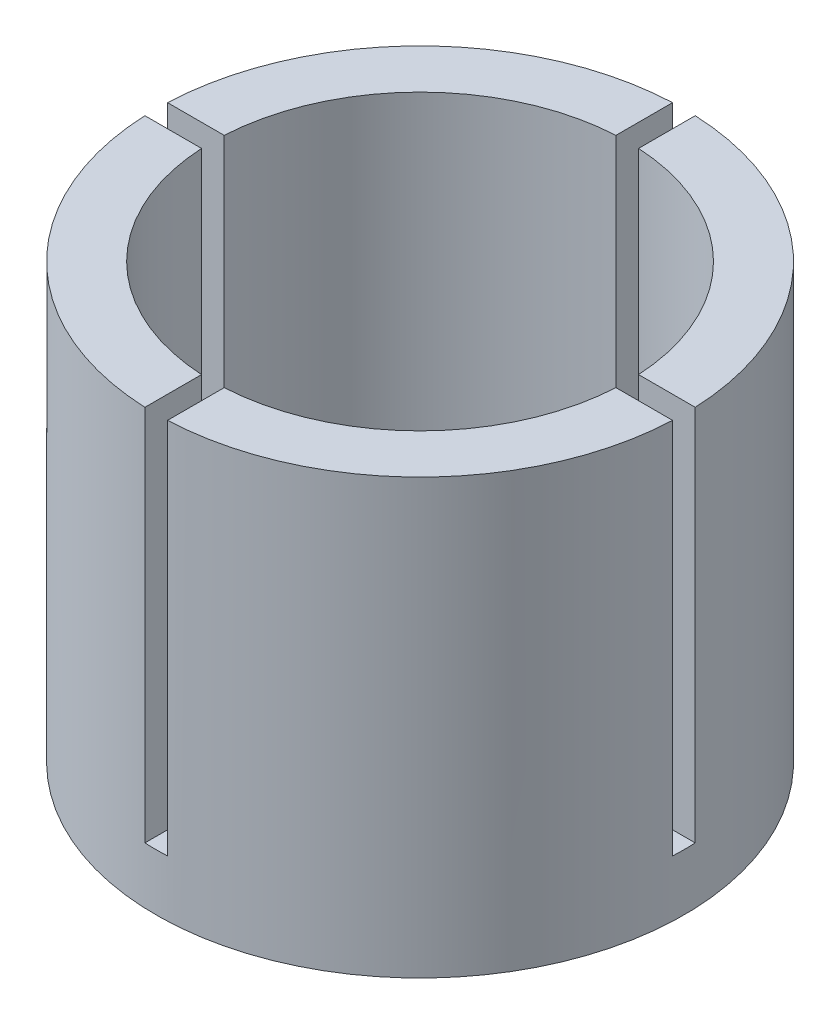
ISO-10303-21;
HEADER;
FILE_DESCRIPTION(('STEP AP214'),'2;1');
FILE_NAME('part.step','',(''),(''),'','','');
FILE_SCHEMA(('AUTOMOTIVE_DESIGN { 1 0 10303 214 1 1 1 1 }'));
ENDSEC;
DATA;
#1=APPLICATION_CONTEXT('core data for automotive mechanical design processes');
#2=APPLICATION_PROTOCOL_DEFINITION('international standard','automotive_design',2000,#1);
#3=PRODUCT_CONTEXT('',#1,'mechanical');
#4=PRODUCT('Part','Part','',(#3));
#5=PRODUCT_RELATED_PRODUCT_CATEGORY('part','',(#4));
#6=PRODUCT_DEFINITION_FORMATION('','',#4);
#7=PRODUCT_DEFINITION_CONTEXT('part definition',#1,'design');
#8=PRODUCT_DEFINITION('design','',#6,#7);
#9=PRODUCT_DEFINITION_SHAPE('','',#8);
#10=(LENGTH_UNIT() NAMED_UNIT(*) SI_UNIT(.MILLI.,.METRE.));
#11=(NAMED_UNIT(*) PLANE_ANGLE_UNIT() SI_UNIT($,.RADIAN.));
#12=(NAMED_UNIT(*) SI_UNIT($,.STERADIAN.) SOLID_ANGLE_UNIT());
#13=UNCERTAINTY_MEASURE_WITH_UNIT(LENGTH_MEASURE(1.E-05),#10,'distance_accuracy_value','');
#14=(GEOMETRIC_REPRESENTATION_CONTEXT(3) GLOBAL_UNCERTAINTY_ASSIGNED_CONTEXT((#13)) GLOBAL_UNIT_ASSIGNED_CONTEXT((#10,
#11,#12)) REPRESENTATION_CONTEXT('',''));
#15=CARTESIAN_POINT('',(0.,0.,0.));
#16=DIRECTION('',(0.,0.,1.));
#17=DIRECTION('',(1.,0.,0.));
#18=AXIS2_PLACEMENT_3D('',#15,#16,#17);
#19=CARTESIAN_POINT('',(14.,23.,0.));
#20=DIRECTION('',(0.,-1.,0.));
#21=DIRECTION('',(1.,0.,0.));
#22=AXIS2_PLACEMENT_3D('',#19,#20,#21);
#23=PLANE('',#22);
#24=DIRECTION('',(0.,0.,-1.));
#25=VECTOR('',#24,1.);
#26=CARTESIAN_POINT('',(-0.600000000000002,23.,0.));
#27=LINE('',#26,#25);
#28=CARTESIAN_POINT('',(-0.600000000000002,23.,13.9871369479247));
#29=VERTEX_POINT('',#28);
#30=CARTESIAN_POINT('',(-0.600000000000002,23.,10.9836241741968));
#31=VERTEX_POINT('',#30);
#32=EDGE_CURVE('E146',#29,#31,#27,.T.);
#33=ORIENTED_EDGE('',*,*,#32,.T.);
#34=CARTESIAN_POINT('',(0.,23.,0.));
#35=DIRECTION('',(0.,1.,0.));
#36=DIRECTION('',(-1.,0.,0.));
#37=AXIS2_PLACEMENT_3D('',#34,#35,#36);
#38=CIRCLE('',#37,11.);
#39=CARTESIAN_POINT('',(-10.9836241741968,23.,0.6));
#40=VERTEX_POINT('',#39);
#41=EDGE_CURVE('E177',#40,#31,#38,.T.);
#42=ORIENTED_EDGE('',*,*,#41,.F.);
#43=DIRECTION('',(1.,0.,0.));
#44=VECTOR('',#43,1.);
#45=CARTESIAN_POINT('',(0.,23.,0.6));
#46=LINE('',#45,#44);
#47=CARTESIAN_POINT('',(-13.9871369479247,23.,0.6));
#48=VERTEX_POINT('',#47);
#49=EDGE_CURVE('E170',#48,#40,#46,.T.);
#50=ORIENTED_EDGE('',*,*,#49,.F.);
#51=CARTESIAN_POINT('',(0.,23.,0.));
#52=DIRECTION('',(0.,1.,0.));
#53=DIRECTION('',(-1.,0.,0.));
#54=AXIS2_PLACEMENT_3D('',#51,#52,#53);
#55=CIRCLE('',#54,14.);
#56=EDGE_CURVE('E41',#48,#29,#55,.T.);
#57=ORIENTED_EDGE('',*,*,#56,.T.);
#58=EDGE_LOOP('',(#33,#42,#50,#57));
#59=FACE_BOUND('',#58,.T.);
#60=ADVANCED_FACE('F33',(#59),#23,.F.);
#61=DIRECTION('',(1.,0.,0.));
#62=VECTOR('',#61,1.);
#63=CARTESIAN_POINT('',(0.,23.,-0.6));
#64=LINE('',#63,#62);
#65=CARTESIAN_POINT('',(10.9836241741968,23.,-0.6));
#66=VERTEX_POINT('',#65);
#67=CARTESIAN_POINT('',(13.9871369479247,23.,-0.6));
#68=VERTEX_POINT('',#67);
#69=EDGE_CURVE('E255',#66,#68,#64,.T.);
#70=ORIENTED_EDGE('',*,*,#69,.T.);
#71=CARTESIAN_POINT('',(0.599999999999998,23.,-13.9871369479247));
#72=VERTEX_POINT('',#71);
#73=EDGE_CURVE('E174',#68,#72,#55,.T.);
#74=ORIENTED_EDGE('',*,*,#73,.T.);
#75=DIRECTION('',(0.,0.,-1.));
#76=VECTOR('',#75,1.);
#77=CARTESIAN_POINT('',(0.599999999999998,23.,0.));
#78=LINE('',#77,#76);
#79=CARTESIAN_POINT('',(0.599999999999998,23.,-10.9836241741968));
#80=VERTEX_POINT('',#79);
#81=EDGE_CURVE('E249',#80,#72,#78,.T.);
#82=ORIENTED_EDGE('',*,*,#81,.F.);
#83=EDGE_CURVE('E188',#66,#80,#38,.T.);
#84=ORIENTED_EDGE('',*,*,#83,.F.);
#85=EDGE_LOOP('',(#70,#74,#82,#84));
#86=FACE_BOUND('',#85,.T.);
#87=ADVANCED_FACE('F325',(#86),#23,.F.);
#88=DIRECTION('',(0.,0.,-1.));
#89=VECTOR('',#88,1.);
#90=CARTESIAN_POINT('',(-0.600000000000002,23.,0.));
#91=LINE('',#90,#89);
#92=CARTESIAN_POINT('',(-0.600000000000002,23.,-10.9836241741968));
#93=VERTEX_POINT('',#92);
#94=CARTESIAN_POINT('',(-0.600000000000002,23.,-13.9871369479247));
#95=VERTEX_POINT('',#94);
#96=EDGE_CURVE('E237',#93,#95,#91,.T.);
#97=ORIENTED_EDGE('',*,*,#96,.T.);
#98=CARTESIAN_POINT('',(-13.9871369479247,23.,-0.6));
#99=VERTEX_POINT('',#98);
#100=EDGE_CURVE('E172',#95,#99,#55,.T.);
#101=ORIENTED_EDGE('',*,*,#100,.T.);
#102=DIRECTION('',(1.,0.,0.));
#103=VECTOR('',#102,1.);
#104=CARTESIAN_POINT('',(0.,23.,-0.6));
#105=LINE('',#104,#103);
#106=CARTESIAN_POINT('',(-10.9836241741968,23.,-0.6));
#107=VERTEX_POINT('',#106);
#108=EDGE_CURVE('E218',#99,#107,#105,.T.);
#109=ORIENTED_EDGE('',*,*,#108,.T.);
#110=EDGE_CURVE('E184',#93,#107,#38,.T.);
#111=ORIENTED_EDGE('',*,*,#110,.F.);
#112=EDGE_LOOP('',(#97,#101,#109,#111));
#113=FACE_BOUND('',#112,.T.);
#114=ADVANCED_FACE('F312',(#113),#23,.F.);
#115=CARTESIAN_POINT('',(0.,8.,0.));
#116=DIRECTION('',(0.,1.,0.));
#117=DIRECTION('',(-1.,0.,0.));
#118=AXIS2_PLACEMENT_3D('',#115,#116,#117);
#119=CYLINDRICAL_SURFACE('',#118,11.);
#120=DIRECTION('',(0.,1.,0.));
#121=VECTOR('',#120,1.);
#122=CARTESIAN_POINT('',(-0.600000000000003,-0.246309153868442,10.9836241741968));
#123=LINE('',#122,#121);
#124=CARTESIAN_POINT('',(-0.600000000000002,3.,10.9836241741968));
#125=VERTEX_POINT('',#124);
#126=EDGE_CURVE('E152',#125,#31,#123,.T.);
#127=ORIENTED_EDGE('',*,*,#126,.F.);
#128=CARTESIAN_POINT('',(0.,3.,0.));
#129=DIRECTION('',(0.,1.,0.));
#130=DIRECTION('',(-1.,0.,0.));
#131=AXIS2_PLACEMENT_3D('',#128,#129,#130);
#132=CIRCLE('',#131,11.);
#133=CARTESIAN_POINT('',(-10.9836241741968,3.,0.6));
#134=VERTEX_POINT('',#133);
#135=EDGE_CURVE('E191',#134,#125,#132,.T.);
#136=ORIENTED_EDGE('',*,*,#135,.F.);
#137=DIRECTION('',(0.,1.,0.));
#138=VECTOR('',#137,1.);
#139=CARTESIAN_POINT('',(-10.9836241741968,-0.246309153868442,0.6));
#140=LINE('',#139,#138);
#141=EDGE_CURVE('E224',#134,#40,#140,.T.);
#142=ORIENTED_EDGE('',*,*,#141,.T.);
#143=ORIENTED_EDGE('',*,*,#41,.T.);
#144=EDGE_LOOP('',(#127,#136,#142,#143));
#145=FACE_BOUND('',#144,.T.);
#146=ADVANCED_FACE('F304',(#145),#119,.F.);
#147=DIRECTION('',(0.,1.,0.));
#148=VECTOR('',#147,1.);
#149=CARTESIAN_POINT('',(10.9836241741968,-0.246309153868442,-0.6));
#150=LINE('',#149,#148);
#151=CARTESIAN_POINT('',(10.9836241741968,3.,-0.6));
#152=VERTEX_POINT('',#151);
#153=EDGE_CURVE('E56',#152,#66,#150,.T.);
#154=ORIENTED_EDGE('',*,*,#153,.T.);
#155=ORIENTED_EDGE('',*,*,#83,.T.);
#156=DIRECTION('',(0.,1.,0.));
#157=VECTOR('',#156,1.);
#158=CARTESIAN_POINT('',(0.599999999999997,-0.246309153868442,-10.9836241741968));
#159=LINE('',#158,#157);
#160=CARTESIAN_POINT('',(0.599999999999997,3.,-10.9836241741968));
#161=VERTEX_POINT('',#160);
#162=EDGE_CURVE('E234',#161,#80,#159,.T.);
#163=ORIENTED_EDGE('',*,*,#162,.F.);
#164=EDGE_CURVE('E202',#152,#161,#132,.T.);
#165=ORIENTED_EDGE('',*,*,#164,.F.);
#166=EDGE_LOOP('',(#154,#155,#163,#165));
#167=FACE_BOUND('',#166,.T.);
#168=ADVANCED_FACE('F322',(#167),#119,.F.);
#169=DIRECTION('',(0.,1.,0.));
#170=VECTOR('',#169,1.);
#171=CARTESIAN_POINT('',(-0.600000000000003,-0.246309153868442,-10.9836241741968));
#172=LINE('',#171,#170);
#173=CARTESIAN_POINT('',(-0.600000000000002,3.,-10.9836241741968));
#174=VERTEX_POINT('',#173);
#175=EDGE_CURVE('E245',#174,#93,#172,.T.);
#176=ORIENTED_EDGE('',*,*,#175,.T.);
#177=ORIENTED_EDGE('',*,*,#110,.T.);
#178=DIRECTION('',(0.,1.,0.));
#179=VECTOR('',#178,1.);
#180=CARTESIAN_POINT('',(-10.9836241741968,-0.246309153868442,-0.6));
#181=LINE('',#180,#179);
#182=CARTESIAN_POINT('',(-10.9836241741968,3.,-0.6));
#183=VERTEX_POINT('',#182);
#184=EDGE_CURVE('E219',#183,#107,#181,.T.);
#185=ORIENTED_EDGE('',*,*,#184,.F.);
#186=EDGE_CURVE('E199',#174,#183,#132,.T.);
#187=ORIENTED_EDGE('',*,*,#186,.F.);
#188=EDGE_LOOP('',(#176,#177,#185,#187));
#189=FACE_BOUND('',#188,.T.);
#190=ADVANCED_FACE('F346',(#189),#119,.F.);
#191=CARTESIAN_POINT('',(0.,0.,0.));
#192=DIRECTION('',(0.,1.,0.));
#193=DIRECTION('',(-1.,0.,0.));
#194=AXIS2_PLACEMENT_3D('',#191,#192,#193);
#195=PLANE('',#194);
#196=CARTESIAN_POINT('',(0.,0.,0.));
#197=DIRECTION('',(0.,1.,0.));
#198=DIRECTION('',(-1.,0.,0.));
#199=AXIS2_PLACEMENT_3D('',#196,#197,#198);
#200=CIRCLE('',#199,14.);
#201=CARTESIAN_POINT('',(-14.,0.,0.));
#202=VERTEX_POINT('',#201);
#203=EDGE_CURVE('E11',#202,#202,#200,.T.);
#204=ORIENTED_EDGE('',*,*,#203,.F.);
#205=EDGE_LOOP('',(#204));
#206=FACE_BOUND('',#205,.T.);
#207=ADVANCED_FACE('F35',(#206),#195,.F.);
#208=CARTESIAN_POINT('',(0.,8.,0.));
#209=DIRECTION('',(0.,1.,0.));
#210=DIRECTION('',(-1.,0.,0.));
#211=AXIS2_PLACEMENT_3D('',#208,#209,#210);
#212=CYLINDRICAL_SURFACE('',#211,14.);
#213=CARTESIAN_POINT('',(0.599999999999998,23.,13.9871369479247));
#214=VERTEX_POINT('',#213);
#215=CARTESIAN_POINT('',(13.9871369479247,23.,0.6));
#216=VERTEX_POINT('',#215);
#217=EDGE_CURVE('E171',#214,#216,#55,.T.);
#218=ORIENTED_EDGE('',*,*,#217,.F.);
#219=DIRECTION('',(0.,1.,0.));
#220=VECTOR('',#219,1.);
#221=CARTESIAN_POINT('',(0.599999999999997,-0.246309153868442,13.9871369479247));
#222=LINE('',#221,#220);
#223=CARTESIAN_POINT('',(0.599999999999997,3.,13.9871369479247));
#224=VERTEX_POINT('',#223);
#225=EDGE_CURVE('E212',#224,#214,#222,.T.);
#226=ORIENTED_EDGE('',*,*,#225,.F.);
#227=CARTESIAN_POINT('',(0.,3.,0.));
#228=DIRECTION('',(0.,-1.,0.));
#229=DIRECTION('',(1.,0.,0.));
#230=AXIS2_PLACEMENT_3D('',#227,#228,#229);
#231=CIRCLE('',#230,14.);
#232=CARTESIAN_POINT('',(-0.600000000000003,3.,13.9871369479247));
#233=VERTEX_POINT('',#232);
#234=EDGE_CURVE('E157',#233,#224,#231,.F.);
#235=ORIENTED_EDGE('',*,*,#234,.F.);
#236=DIRECTION('',(0.,1.,0.));
#237=VECTOR('',#236,1.);
#238=CARTESIAN_POINT('',(-0.600000000000003,-0.246309153868442,13.9871369479247));
#239=LINE('',#238,#237);
#240=EDGE_CURVE('E149',#233,#29,#239,.T.);
#241=ORIENTED_EDGE('',*,*,#240,.T.);
#242=ORIENTED_EDGE('',*,*,#56,.F.);
#243=DIRECTION('',(0.,1.,0.));
#244=VECTOR('',#243,1.);
#245=CARTESIAN_POINT('',(-13.9871369479247,-0.246309153868442,0.6));
#246=LINE('',#245,#244);
#247=CARTESIAN_POINT('',(-13.9871369479247,3.,0.6));
#248=VERTEX_POINT('',#247);
#249=EDGE_CURVE('E220',#248,#48,#246,.T.);
#250=ORIENTED_EDGE('',*,*,#249,.F.);
#251=CARTESIAN_POINT('',(0.,3.,0.));
#252=DIRECTION('',(0.,-1.,0.));
#253=DIRECTION('',(1.,0.,0.));
#254=AXIS2_PLACEMENT_3D('',#251,#252,#253);
#255=CIRCLE('',#254,14.);
#256=CARTESIAN_POINT('',(-13.9871369479247,3.,-0.6));
#257=VERTEX_POINT('',#256);
#258=EDGE_CURVE('E223',#257,#248,#255,.F.);
#259=ORIENTED_EDGE('',*,*,#258,.F.);
#260=DIRECTION('',(0.,1.,0.));
#261=VECTOR('',#260,1.);
#262=CARTESIAN_POINT('',(-13.9871369479247,-0.246309153868442,-0.6));
#263=LINE('',#262,#261);
#264=EDGE_CURVE('E215',#257,#99,#263,.T.);
#265=ORIENTED_EDGE('',*,*,#264,.T.);
#266=ORIENTED_EDGE('',*,*,#100,.F.);
#267=DIRECTION('',(0.,1.,0.));
#268=VECTOR('',#267,1.);
#269=CARTESIAN_POINT('',(-0.600000000000003,-0.246309153868442,-13.9871369479247));
#270=LINE('',#269,#268);
#271=CARTESIAN_POINT('',(-0.600000000000002,3.,-13.9871369479247));
#272=VERTEX_POINT('',#271);
#273=EDGE_CURVE('E243',#272,#95,#270,.T.);
#274=ORIENTED_EDGE('',*,*,#273,.F.);
#275=CARTESIAN_POINT('',(0.,3.,0.));
#276=DIRECTION('',(0.,-1.,0.));
#277=DIRECTION('',(1.,0.,0.));
#278=AXIS2_PLACEMENT_3D('',#275,#276,#277);
#279=CIRCLE('',#278,14.);
#280=CARTESIAN_POINT('',(0.599999999999997,3.,-13.9871369479247));
#281=VERTEX_POINT('',#280);
#282=EDGE_CURVE('E241',#281,#272,#279,.F.);
#283=ORIENTED_EDGE('',*,*,#282,.F.);
#284=DIRECTION('',(0.,1.,0.));
#285=VECTOR('',#284,1.);
#286=CARTESIAN_POINT('',(0.599999999999997,-0.246309153868442,-13.9871369479247));
#287=LINE('',#286,#285);
#288=EDGE_CURVE('E238',#281,#72,#287,.T.);
#289=ORIENTED_EDGE('',*,*,#288,.T.);
#290=ORIENTED_EDGE('',*,*,#73,.F.);
#291=DIRECTION('',(0.,1.,0.));
#292=VECTOR('',#291,1.);
#293=CARTESIAN_POINT('',(13.9871369479247,-0.246309153868442,-0.6));
#294=LINE('',#293,#292);
#295=CARTESIAN_POINT('',(13.9871369479247,3.,-0.6));
#296=VERTEX_POINT('',#295);
#297=EDGE_CURVE('E256',#296,#68,#294,.T.);
#298=ORIENTED_EDGE('',*,*,#297,.F.);
#299=CARTESIAN_POINT('',(0.,3.,0.));
#300=DIRECTION('',(0.,-1.,0.));
#301=DIRECTION('',(1.,0.,0.));
#302=AXIS2_PLACEMENT_3D('',#299,#300,#301);
#303=CIRCLE('',#302,14.);
#304=CARTESIAN_POINT('',(13.9871369479247,3.,0.6));
#305=VERTEX_POINT('',#304);
#306=EDGE_CURVE('E264',#305,#296,#303,.F.);
#307=ORIENTED_EDGE('',*,*,#306,.F.);
#308=DIRECTION('',(0.,1.,0.));
#309=VECTOR('',#308,1.);
#310=CARTESIAN_POINT('',(13.9871369479247,-0.246309153868442,0.6));
#311=LINE('',#310,#309);
#312=EDGE_CURVE('E261',#305,#216,#311,.T.);
#313=ORIENTED_EDGE('',*,*,#312,.T.);
#314=EDGE_LOOP('',(#218,#226,#235,#241,#242,#250,#259,#265,#266,#274,#283,#289,#290,#298,#307,#313));
#315=FACE_BOUND('',#314,.T.);
#316=ORIENTED_EDGE('',*,*,#203,.T.);
#317=EDGE_LOOP('',(#316));
#318=FACE_BOUND('',#317,.T.);
#319=ADVANCED_FACE('F163',(#315,#318),#212,.T.);
#320=CARTESIAN_POINT('',(0.599999999999998,23.,10.9836241741968));
#321=VERTEX_POINT('',#320);
#322=CARTESIAN_POINT('',(10.9836241741968,23.,0.6));
#323=VERTEX_POINT('',#322);
#324=EDGE_CURVE('E183',#321,#323,#38,.T.);
#325=ORIENTED_EDGE('',*,*,#324,.F.);
#326=DIRECTION('',(0.,0.,-1.));
#327=VECTOR('',#326,1.);
#328=CARTESIAN_POINT('',(0.599999999999998,23.,0.));
#329=LINE('',#328,#327);
#330=EDGE_CURVE('E282',#214,#321,#329,.T.);
#331=ORIENTED_EDGE('',*,*,#330,.F.);
#332=ORIENTED_EDGE('',*,*,#217,.T.);
#333=DIRECTION('',(1.,0.,0.));
#334=VECTOR('',#333,1.);
#335=CARTESIAN_POINT('',(0.,23.,0.6));
#336=LINE('',#335,#334);
#337=EDGE_CURVE('E260',#323,#216,#336,.T.);
#338=ORIENTED_EDGE('',*,*,#337,.F.);
#339=EDGE_LOOP('',(#325,#331,#332,#338));
#340=FACE_BOUND('',#339,.T.);
#341=ADVANCED_FACE('F296',(#340),#23,.F.);
#342=CARTESIAN_POINT('',(0.599999999999998,3.,10.9836241741968));
#343=VERTEX_POINT('',#342);
#344=CARTESIAN_POINT('',(10.9836241741968,3.,0.6));
#345=VERTEX_POINT('',#344);
#346=EDGE_CURVE('E198',#343,#345,#132,.T.);
#347=ORIENTED_EDGE('',*,*,#346,.F.);
#348=DIRECTION('',(0.,1.,0.));
#349=VECTOR('',#348,1.);
#350=CARTESIAN_POINT('',(0.599999999999997,-0.246309153868442,10.9836241741968));
#351=LINE('',#350,#349);
#352=EDGE_CURVE('E276',#343,#321,#351,.T.);
#353=ORIENTED_EDGE('',*,*,#352,.T.);
#354=ORIENTED_EDGE('',*,*,#324,.T.);
#355=DIRECTION('',(0.,1.,0.));
#356=VECTOR('',#355,1.);
#357=CARTESIAN_POINT('',(10.9836241741968,-0.246309153868442,0.6));
#358=LINE('',#357,#356);
#359=EDGE_CURVE('E257',#345,#323,#358,.T.);
#360=ORIENTED_EDGE('',*,*,#359,.F.);
#361=EDGE_LOOP('',(#347,#353,#354,#360));
#362=FACE_BOUND('',#361,.T.);
#363=ADVANCED_FACE('F293',(#362),#119,.F.);
#364=CARTESIAN_POINT('',(11.,3.,0.));
#365=DIRECTION('',(0.,-1.,0.));
#366=DIRECTION('',(1.,0.,0.));
#367=AXIS2_PLACEMENT_3D('',#364,#365,#366);
#368=PLANE('',#367);
#369=CARTESIAN_POINT('',(0.,3.,0.));
#370=DIRECTION('',(0.,1.,0.));
#371=DIRECTION('',(-1.,0.,0.));
#372=AXIS2_PLACEMENT_3D('',#369,#370,#371);
#373=CIRCLE('',#372,7.5);
#374=CARTESIAN_POINT('',(-7.5,3.,0.));
#375=VERTEX_POINT('',#374);
#376=EDGE_CURVE('E204',#375,#375,#373,.T.);
#377=ORIENTED_EDGE('',*,*,#376,.F.);
#378=EDGE_LOOP('',(#377));
#379=FACE_BOUND('',#378,.T.);
#380=ORIENTED_EDGE('',*,*,#135,.T.);
#381=DIRECTION('',(0.,0.,-1.));
#382=VECTOR('',#381,1.);
#383=CARTESIAN_POINT('',(-0.600000000000003,3.,0.));
#384=LINE('',#383,#382);
#385=EDGE_CURVE('E273',#233,#125,#384,.T.);
#386=ORIENTED_EDGE('',*,*,#385,.F.);
#387=ORIENTED_EDGE('',*,*,#234,.T.);
#388=DIRECTION('',(0.,0.,-1.));
#389=VECTOR('',#388,1.);
#390=CARTESIAN_POINT('',(0.599999999999997,3.,0.));
#391=LINE('',#390,#389);
#392=EDGE_CURVE('E279',#224,#343,#391,.T.);
#393=ORIENTED_EDGE('',*,*,#392,.T.);
#394=ORIENTED_EDGE('',*,*,#346,.T.);
#395=DIRECTION('',(1.,0.,0.));
#396=VECTOR('',#395,1.);
#397=CARTESIAN_POINT('',(0.,3.,0.6));
#398=LINE('',#397,#396);
#399=EDGE_CURVE('E259',#345,#305,#398,.T.);
#400=ORIENTED_EDGE('',*,*,#399,.T.);
#401=ORIENTED_EDGE('',*,*,#306,.T.);
#402=DIRECTION('',(1.,0.,0.));
#403=VECTOR('',#402,1.);
#404=CARTESIAN_POINT('',(0.,3.,-0.6));
#405=LINE('',#404,#403);
#406=EDGE_CURVE('E236',#152,#296,#405,.T.);
#407=ORIENTED_EDGE('',*,*,#406,.F.);
#408=ORIENTED_EDGE('',*,*,#164,.T.);
#409=DIRECTION('',(0.,0.,-1.));
#410=VECTOR('',#409,1.);
#411=CARTESIAN_POINT('',(0.599999999999997,3.,0.));
#412=LINE('',#411,#410);
#413=EDGE_CURVE('E242',#161,#281,#412,.T.);
#414=ORIENTED_EDGE('',*,*,#413,.T.);
#415=ORIENTED_EDGE('',*,*,#282,.T.);
#416=DIRECTION('',(0.,0.,-1.));
#417=VECTOR('',#416,1.);
#418=CARTESIAN_POINT('',(-0.600000000000003,3.,0.));
#419=LINE('',#418,#417);
#420=EDGE_CURVE('E48',#174,#272,#419,.T.);
#421=ORIENTED_EDGE('',*,*,#420,.F.);
#422=ORIENTED_EDGE('',*,*,#186,.T.);
#423=DIRECTION('',(1.,0.,0.));
#424=VECTOR('',#423,1.);
#425=CARTESIAN_POINT('',(0.,3.,-0.6));
#426=LINE('',#425,#424);
#427=EDGE_CURVE('E228',#257,#183,#426,.T.);
#428=ORIENTED_EDGE('',*,*,#427,.F.);
#429=ORIENTED_EDGE('',*,*,#258,.T.);
#430=DIRECTION('',(1.,0.,0.));
#431=VECTOR('',#430,1.);
#432=CARTESIAN_POINT('',(0.,3.,0.6));
#433=LINE('',#432,#431);
#434=EDGE_CURVE('E222',#248,#134,#433,.T.);
#435=ORIENTED_EDGE('',*,*,#434,.T.);
#436=EDGE_LOOP('',(#380,#386,#387,#393,#394,#400,#401,#407,#408,#414,#415,#421,#422,#428,#429,#435));
#437=FACE_BOUND('',#436,.T.);
#438=ADVANCED_FACE('F302',(#379,#437),#368,.F.);
#439=CARTESIAN_POINT('',(0.,8.,0.));
#440=DIRECTION('',(0.,1.,0.));
#441=DIRECTION('',(-1.,0.,0.));
#442=AXIS2_PLACEMENT_3D('',#439,#440,#441);
#443=CYLINDRICAL_SURFACE('',#442,7.5);
#444=CARTESIAN_POINT('',(0.,8.,0.));
#445=DIRECTION('',(0.,1.,0.));
#446=DIRECTION('',(-1.,0.,0.));
#447=AXIS2_PLACEMENT_3D('',#444,#445,#446);
#448=CIRCLE('',#447,7.5);
#449=CARTESIAN_POINT('',(-7.5,8.,0.));
#450=VERTEX_POINT('',#449);
#451=EDGE_CURVE('E208',#450,#450,#448,.T.);
#452=ORIENTED_EDGE('',*,*,#451,.F.);
#453=EDGE_LOOP('',(#452));
#454=FACE_BOUND('',#453,.T.);
#455=ORIENTED_EDGE('',*,*,#376,.T.);
#456=EDGE_LOOP('',(#455));
#457=FACE_BOUND('',#456,.T.);
#458=ADVANCED_FACE('F357',(#454,#457),#443,.T.);
#459=CARTESIAN_POINT('',(7.5,8.,0.));
#460=DIRECTION('',(0.,-1.,0.));
#461=DIRECTION('',(1.,0.,0.));
#462=AXIS2_PLACEMENT_3D('',#459,#460,#461);
#463=PLANE('',#462);
#464=ORIENTED_EDGE('',*,*,#451,.T.);
#465=EDGE_LOOP('',(#464));
#466=FACE_BOUND('',#465,.T.);
#467=ADVANCED_FACE('F361',(#466),#463,.F.);
#468=CARTESIAN_POINT('',(0.,-0.246309153868442,0.6));
#469=DIRECTION('',(0.,0.,1.));
#470=DIRECTION('',(1.,0.,0.));
#471=AXIS2_PLACEMENT_3D('',#468,#469,#470);
#472=PLANE('',#471);
#473=ORIENTED_EDGE('',*,*,#249,.T.);
#474=ORIENTED_EDGE('',*,*,#49,.T.);
#475=ORIENTED_EDGE('',*,*,#141,.F.);
#476=ORIENTED_EDGE('',*,*,#434,.F.);
#477=EDGE_LOOP('',(#473,#474,#475,#476));
#478=FACE_BOUND('',#477,.T.);
#479=ADVANCED_FACE('F307',(#478),#472,.F.);
#480=CARTESIAN_POINT('',(0.,-0.246309153868442,-0.6));
#481=DIRECTION('',(0.,0.,1.));
#482=DIRECTION('',(1.,0.,0.));
#483=AXIS2_PLACEMENT_3D('',#480,#481,#482);
#484=PLANE('',#483);
#485=ORIENTED_EDGE('',*,*,#427,.T.);
#486=ORIENTED_EDGE('',*,*,#184,.T.);
#487=ORIENTED_EDGE('',*,*,#108,.F.);
#488=ORIENTED_EDGE('',*,*,#264,.F.);
#489=EDGE_LOOP('',(#485,#486,#487,#488));
#490=FACE_BOUND('',#489,.T.);
#491=ADVANCED_FACE('F311',(#490),#484,.T.);
#492=CARTESIAN_POINT('',(0.599999999999997,-0.246309153868442,0.));
#493=DIRECTION('',(1.,0.,0.));
#494=DIRECTION('',(0.,1.,0.));
#495=AXIS2_PLACEMENT_3D('',#492,#493,#494);
#496=PLANE('',#495);
#497=ORIENTED_EDGE('',*,*,#162,.T.);
#498=ORIENTED_EDGE('',*,*,#81,.T.);
#499=ORIENTED_EDGE('',*,*,#288,.F.);
#500=ORIENTED_EDGE('',*,*,#413,.F.);
#501=EDGE_LOOP('',(#497,#498,#499,#500));
#502=FACE_BOUND('',#501,.T.);
#503=ADVANCED_FACE('F319',(#502),#496,.F.);
#504=CARTESIAN_POINT('',(-0.600000000000003,-0.246309153868442,0.));
#505=DIRECTION('',(1.,0.,0.));
#506=DIRECTION('',(0.,1.,0.));
#507=AXIS2_PLACEMENT_3D('',#504,#505,#506);
#508=PLANE('',#507);
#509=ORIENTED_EDGE('',*,*,#420,.T.);
#510=ORIENTED_EDGE('',*,*,#273,.T.);
#511=ORIENTED_EDGE('',*,*,#96,.F.);
#512=ORIENTED_EDGE('',*,*,#175,.F.);
#513=EDGE_LOOP('',(#509,#510,#511,#512));
#514=FACE_BOUND('',#513,.T.);
#515=ADVANCED_FACE('F316',(#514),#508,.T.);
#516=CARTESIAN_POINT('',(0.,-0.246309153868442,0.6));
#517=DIRECTION('',(0.,0.,1.));
#518=DIRECTION('',(1.,0.,0.));
#519=AXIS2_PLACEMENT_3D('',#516,#517,#518);
#520=PLANE('',#519);
#521=ORIENTED_EDGE('',*,*,#359,.T.);
#522=ORIENTED_EDGE('',*,*,#337,.T.);
#523=ORIENTED_EDGE('',*,*,#312,.F.);
#524=ORIENTED_EDGE('',*,*,#399,.F.);
#525=EDGE_LOOP('',(#521,#522,#523,#524));
#526=FACE_BOUND('',#525,.T.);
#527=ADVANCED_FACE('F298',(#526),#520,.F.);
#528=CARTESIAN_POINT('',(0.,-0.246309153868442,-0.6));
#529=DIRECTION('',(0.,0.,1.));
#530=DIRECTION('',(1.,0.,0.));
#531=AXIS2_PLACEMENT_3D('',#528,#529,#530);
#532=PLANE('',#531);
#533=ORIENTED_EDGE('',*,*,#406,.T.);
#534=ORIENTED_EDGE('',*,*,#297,.T.);
#535=ORIENTED_EDGE('',*,*,#69,.F.);
#536=ORIENTED_EDGE('',*,*,#153,.F.);
#537=EDGE_LOOP('',(#533,#534,#535,#536));
#538=FACE_BOUND('',#537,.T.);
#539=ADVANCED_FACE('F326',(#538),#532,.T.);
#540=CARTESIAN_POINT('',(0.599999999999997,-0.246309153868442,0.));
#541=DIRECTION('',(1.,0.,0.));
#542=DIRECTION('',(0.,1.,0.));
#543=AXIS2_PLACEMENT_3D('',#540,#541,#542);
#544=PLANE('',#543);
#545=ORIENTED_EDGE('',*,*,#225,.T.);
#546=ORIENTED_EDGE('',*,*,#330,.T.);
#547=ORIENTED_EDGE('',*,*,#352,.F.);
#548=ORIENTED_EDGE('',*,*,#392,.F.);
#549=EDGE_LOOP('',(#545,#546,#547,#548));
#550=FACE_BOUND('',#549,.T.);
#551=ADVANCED_FACE('F288',(#550),#544,.F.);
#552=CARTESIAN_POINT('',(-0.600000000000003,-0.246309153868442,0.));
#553=DIRECTION('',(1.,0.,0.));
#554=DIRECTION('',(0.,1.,0.));
#555=AXIS2_PLACEMENT_3D('',#552,#553,#554);
#556=PLANE('',#555);
#557=ORIENTED_EDGE('',*,*,#385,.T.);
#558=ORIENTED_EDGE('',*,*,#126,.T.);
#559=ORIENTED_EDGE('',*,*,#32,.F.);
#560=ORIENTED_EDGE('',*,*,#240,.F.);
#561=EDGE_LOOP('',(#557,#558,#559,#560));
#562=FACE_BOUND('',#561,.T.);
#563=ADVANCED_FACE('F148',(#562),#556,.T.);
#564=CLOSED_SHELL('',(#60,#87,#114,#146,#168,#190,#207,#319,#341,#363,#438,#458,#467,#479,#491,
#503,#515,#527,#539,#551,#563));
#565=MANIFOLD_SOLID_BREP('B2',#564);
#566=ADVANCED_BREP_SHAPE_REPRESENTATION('',(#18,#565),#14);
#567=SHAPE_DEFINITION_REPRESENTATION(#9,#566);
ENDSEC;
END-ISO-10303-21;
